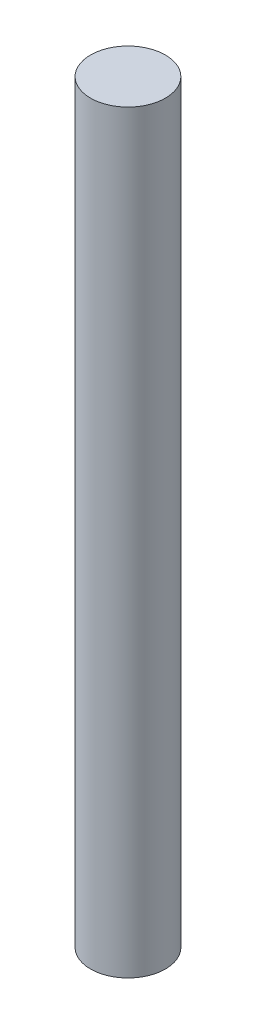
ISO-10303-21;
HEADER;
FILE_DESCRIPTION(('STEP AP214'),'2;1');
FILE_NAME('part.step','',(''),(''),'','','');
FILE_SCHEMA(('AUTOMOTIVE_DESIGN { 1 0 10303 214 1 1 1 1 }'));
ENDSEC;
DATA;
#1=APPLICATION_CONTEXT('core data for automotive mechanical design processes');
#2=APPLICATION_PROTOCOL_DEFINITION('international standard','automotive_design',2000,#1);
#3=PRODUCT_CONTEXT('',#1,'mechanical');
#4=PRODUCT('Part','Part','',(#3));
#5=PRODUCT_RELATED_PRODUCT_CATEGORY('part','',(#4));
#6=PRODUCT_DEFINITION_FORMATION('','',#4);
#7=PRODUCT_DEFINITION_CONTEXT('part definition',#1,'design');
#8=PRODUCT_DEFINITION('design','',#6,#7);
#9=PRODUCT_DEFINITION_SHAPE('','',#8);
#10=(LENGTH_UNIT() NAMED_UNIT(*) SI_UNIT(.MILLI.,.METRE.));
#11=(NAMED_UNIT(*) PLANE_ANGLE_UNIT() SI_UNIT($,.RADIAN.));
#12=(NAMED_UNIT(*) SI_UNIT($,.STERADIAN.) SOLID_ANGLE_UNIT());
#13=UNCERTAINTY_MEASURE_WITH_UNIT(LENGTH_MEASURE(1.E-05),#10,'distance_accuracy_value','');
#14=(GEOMETRIC_REPRESENTATION_CONTEXT(3) GLOBAL_UNCERTAINTY_ASSIGNED_CONTEXT((#13)) GLOBAL_UNIT_ASSIGNED_CONTEXT((#10,
#11,#12)) REPRESENTATION_CONTEXT('',''));
#15=CARTESIAN_POINT('',(0.,0.,0.));
#16=DIRECTION('',(0.,0.,1.));
#17=DIRECTION('',(1.,0.,0.));
#18=AXIS2_PLACEMENT_3D('',#15,#16,#17);
#19=CARTESIAN_POINT('',(0.,192.,0.));
#20=DIRECTION('',(0.,-1.,0.));
#21=DIRECTION('',(0.,0.,-1.));
#22=AXIS2_PLACEMENT_3D('',#19,#20,#21);
#23=CYLINDRICAL_SURFACE('',#22,9.525);
#24=CARTESIAN_POINT('',(0.,192.,0.));
#25=DIRECTION('',(0.,1.,0.));
#26=DIRECTION('',(0.,0.,1.));
#27=AXIS2_PLACEMENT_3D('',#24,#25,#26);
#28=CIRCLE('',#27,9.525);
#29=CARTESIAN_POINT('',(0.,192.,9.525));
#30=VERTEX_POINT('',#29);
#31=EDGE_CURVE('E10',#30,#30,#28,.T.);
#32=ORIENTED_EDGE('',*,*,#31,.F.);
#33=EDGE_LOOP('',(#32));
#34=FACE_BOUND('',#33,.T.);
#35=CARTESIAN_POINT('',(0.,0.,0.));
#36=DIRECTION('',(0.,1.,0.));
#37=DIRECTION('',(0.,0.,1.));
#38=AXIS2_PLACEMENT_3D('',#35,#36,#37);
#39=CIRCLE('',#38,9.525);
#40=CARTESIAN_POINT('',(0.,0.,9.525));
#41=VERTEX_POINT('',#40);
#42=EDGE_CURVE('E35',#41,#41,#39,.T.);
#43=ORIENTED_EDGE('',*,*,#42,.T.);
#44=EDGE_LOOP('',(#43));
#45=FACE_BOUND('',#44,.T.);
#46=ADVANCED_FACE('F32',(#34,#45),#23,.T.);
#47=CARTESIAN_POINT('',(0.,192.,0.));
#48=DIRECTION('',(0.,1.,0.));
#49=DIRECTION('',(0.,0.,1.));
#50=AXIS2_PLACEMENT_3D('',#47,#48,#49);
#51=PLANE('',#50);
#52=ORIENTED_EDGE('',*,*,#31,.T.);
#53=EDGE_LOOP('',(#52));
#54=FACE_BOUND('',#53,.T.);
#55=ADVANCED_FACE('F47',(#54),#51,.T.);
#56=CARTESIAN_POINT('',(0.,0.,0.));
#57=DIRECTION('',(0.,1.,0.));
#58=DIRECTION('',(0.,0.,1.));
#59=AXIS2_PLACEMENT_3D('',#56,#57,#58);
#60=PLANE('',#59);
#61=ORIENTED_EDGE('',*,*,#42,.F.);
#62=EDGE_LOOP('',(#61));
#63=FACE_BOUND('',#62,.T.);
#64=ADVANCED_FACE('F45',(#63),#60,.F.);
#65=CLOSED_SHELL('',(#46,#55,#64));
#66=MANIFOLD_SOLID_BREP('B2',#65);
#67=ADVANCED_BREP_SHAPE_REPRESENTATION('',(#18,#66),#14);
#68=SHAPE_DEFINITION_REPRESENTATION(#9,#67);
ENDSEC;
END-ISO-10303-21;
